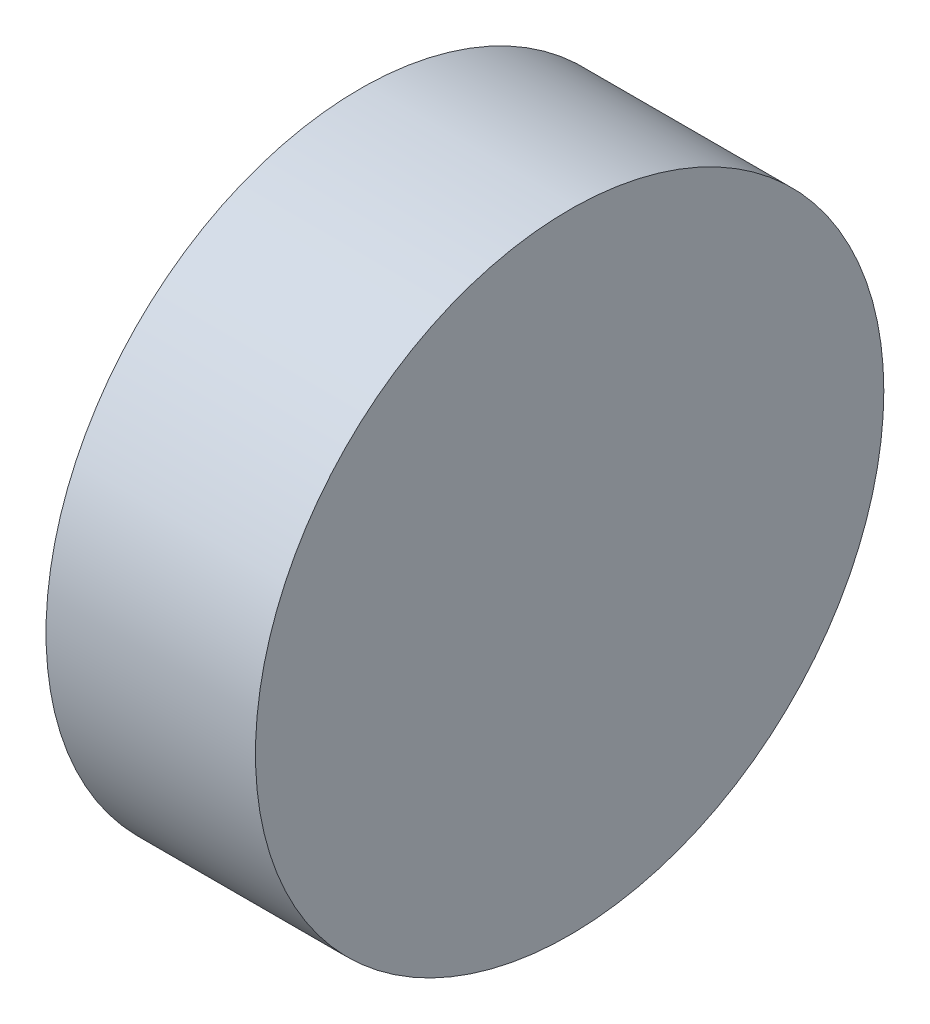
ISO-10303-21;
HEADER;
FILE_DESCRIPTION(('STEP AP214'),'2;1');
FILE_NAME('part.step','',(''),(''),'','','');
FILE_SCHEMA(('AUTOMOTIVE_DESIGN { 1 0 10303 214 1 1 1 1 }'));
ENDSEC;
DATA;
#1=APPLICATION_CONTEXT('core data for automotive mechanical design processes');
#2=APPLICATION_PROTOCOL_DEFINITION('international standard','automotive_design',2000,#1);
#3=PRODUCT_CONTEXT('',#1,'mechanical');
#4=PRODUCT('Part','Part','',(#3));
#5=PRODUCT_RELATED_PRODUCT_CATEGORY('part','',(#4));
#6=PRODUCT_DEFINITION_FORMATION('','',#4);
#7=PRODUCT_DEFINITION_CONTEXT('part definition',#1,'design');
#8=PRODUCT_DEFINITION('design','',#6,#7);
#9=PRODUCT_DEFINITION_SHAPE('','',#8);
#10=(LENGTH_UNIT() NAMED_UNIT(*) SI_UNIT(.MILLI.,.METRE.));
#11=(NAMED_UNIT(*) PLANE_ANGLE_UNIT() SI_UNIT($,.RADIAN.));
#12=(NAMED_UNIT(*) SI_UNIT($,.STERADIAN.) SOLID_ANGLE_UNIT());
#13=UNCERTAINTY_MEASURE_WITH_UNIT(LENGTH_MEASURE(1.E-05),#10,'distance_accuracy_value','');
#14=(GEOMETRIC_REPRESENTATION_CONTEXT(3) GLOBAL_UNCERTAINTY_ASSIGNED_CONTEXT((#13)) GLOBAL_UNIT_ASSIGNED_CONTEXT((#10,
#11,#12)) REPRESENTATION_CONTEXT('',''));
#15=CARTESIAN_POINT('',(0.,0.,0.));
#16=DIRECTION('',(0.,0.,1.));
#17=DIRECTION('',(1.,0.,0.));
#18=AXIS2_PLACEMENT_3D('',#15,#16,#17);
#19=CARTESIAN_POINT('',(-3.8,0.,0.9));
#20=DIRECTION('',(1.,0.,0.));
#21=DIRECTION('',(0.,0.,-1.));
#22=AXIS2_PLACEMENT_3D('',#19,#20,#21);
#23=PLANE('',#22);
#24=CARTESIAN_POINT('',(-3.8,0.,0.));
#25=DIRECTION('',(1.,0.,0.));
#26=DIRECTION('',(0.,0.,-1.));
#27=AXIS2_PLACEMENT_3D('',#24,#25,#26);
#28=CIRCLE('',#27,1.8);
#29=CARTESIAN_POINT('',(-3.8,0.,-1.8));
#30=VERTEX_POINT('',#29);
#31=EDGE_CURVE('E18',#30,#30,#28,.F.);
#32=ORIENTED_EDGE('',*,*,#31,.F.);
#33=EDGE_LOOP('',(#32));
#34=FACE_BOUND('',#33,.T.);
#35=ADVANCED_FACE('F15',(#34),#23,.T.);
#36=CARTESIAN_POINT('',(-4.4,0.,0.));
#37=DIRECTION('',(1.,0.,0.));
#38=DIRECTION('',(0.,0.,-1.));
#39=AXIS2_PLACEMENT_3D('',#36,#37,#38);
#40=CYLINDRICAL_SURFACE('',#39,1.8);
#41=ORIENTED_EDGE('',*,*,#31,.T.);
#42=EDGE_LOOP('',(#41));
#43=FACE_BOUND('',#42,.T.);
#44=CARTESIAN_POINT('',(-5.,0.,0.));
#45=DIRECTION('',(1.,0.,0.));
#46=DIRECTION('',(0.,0.,-1.));
#47=AXIS2_PLACEMENT_3D('',#44,#45,#46);
#48=CIRCLE('',#47,1.8);
#49=CARTESIAN_POINT('',(-5.,0.,-1.8));
#50=VERTEX_POINT('',#49);
#51=EDGE_CURVE('E10',#50,#50,#48,.F.);
#52=ORIENTED_EDGE('',*,*,#51,.F.);
#53=EDGE_LOOP('',(#52));
#54=FACE_BOUND('',#53,.T.);
#55=ADVANCED_FACE('F27',(#43,#54),#40,.T.);
#56=CARTESIAN_POINT('',(-5.,0.,0.9));
#57=DIRECTION('',(-1.,0.,0.));
#58=DIRECTION('',(0.,0.,1.));
#59=AXIS2_PLACEMENT_3D('',#56,#57,#58);
#60=PLANE('',#59);
#61=ORIENTED_EDGE('',*,*,#51,.T.);
#62=EDGE_LOOP('',(#61));
#63=FACE_BOUND('',#62,.T.);
#64=ADVANCED_FACE('F35',(#63),#60,.T.);
#65=CLOSED_SHELL('',(#35,#55,#64));
#66=MANIFOLD_SOLID_BREP('B1',#65);
#67=ADVANCED_BREP_SHAPE_REPRESENTATION('',(#18,#66),#14);
#68=SHAPE_DEFINITION_REPRESENTATION(#9,#67);
ENDSEC;
END-ISO-10303-21;
